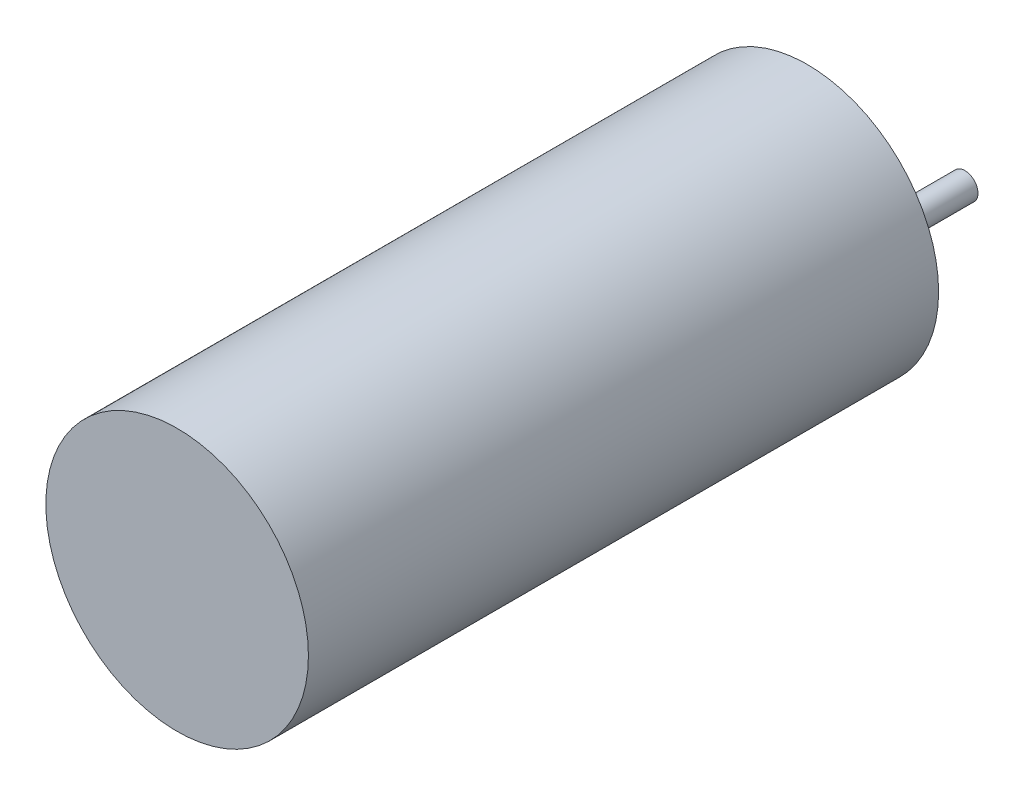
ISO-10303-21;
HEADER;
FILE_DESCRIPTION(('STEP AP214'),'2;1');
FILE_NAME('part.step','',(''),(''),'','','');
FILE_SCHEMA(('AUTOMOTIVE_DESIGN { 1 0 10303 214 1 1 1 1 }'));
ENDSEC;
DATA;
#1=APPLICATION_CONTEXT('core data for automotive mechanical design processes');
#2=APPLICATION_PROTOCOL_DEFINITION('international standard','automotive_design',2000,#1);
#3=PRODUCT_CONTEXT('',#1,'mechanical');
#4=PRODUCT('Part','Part','',(#3));
#5=PRODUCT_RELATED_PRODUCT_CATEGORY('part','',(#4));
#6=PRODUCT_DEFINITION_FORMATION('','',#4);
#7=PRODUCT_DEFINITION_CONTEXT('part definition',#1,'design');
#8=PRODUCT_DEFINITION('design','',#6,#7);
#9=PRODUCT_DEFINITION_SHAPE('','',#8);
#10=(LENGTH_UNIT() NAMED_UNIT(*) SI_UNIT(.MILLI.,.METRE.));
#11=(NAMED_UNIT(*) PLANE_ANGLE_UNIT() SI_UNIT($,.RADIAN.));
#12=(NAMED_UNIT(*) SI_UNIT($,.STERADIAN.) SOLID_ANGLE_UNIT());
#13=UNCERTAINTY_MEASURE_WITH_UNIT(LENGTH_MEASURE(1.E-05),#10,'distance_accuracy_value','');
#14=(GEOMETRIC_REPRESENTATION_CONTEXT(3) GLOBAL_UNCERTAINTY_ASSIGNED_CONTEXT((#13)) GLOBAL_UNIT_ASSIGNED_CONTEXT((#10,
#11,#12)) REPRESENTATION_CONTEXT('',''));
#15=CARTESIAN_POINT('',(0.,0.,0.));
#16=DIRECTION('',(0.,0.,1.));
#17=DIRECTION('',(1.,0.,0.));
#18=AXIS2_PLACEMENT_3D('',#15,#16,#17);
#19=CARTESIAN_POINT('',(0.,0.,12.));
#20=DIRECTION('',(0.,0.,-1.));
#21=DIRECTION('',(-1.,0.,0.));
#22=AXIS2_PLACEMENT_3D('',#19,#20,#21);
#23=CYLINDRICAL_SURFACE('',#22,2.5);
#24=CARTESIAN_POINT('',(0.,0.,12.));
#25=DIRECTION('',(0.,0.,1.));
#26=DIRECTION('',(1.,0.,0.));
#27=AXIS2_PLACEMENT_3D('',#24,#25,#26);
#28=CIRCLE('',#27,2.5);
#29=CARTESIAN_POINT('',(2.5,0.,12.));
#30=VERTEX_POINT('',#29);
#31=EDGE_CURVE('E58',#30,#30,#28,.T.);
#32=ORIENTED_EDGE('',*,*,#31,.F.);
#33=EDGE_LOOP('',(#32));
#34=FACE_BOUND('',#33,.T.);
#35=CARTESIAN_POINT('',(0.,0.,0.));
#36=DIRECTION('',(0.,0.,1.));
#37=DIRECTION('',(1.,0.,0.));
#38=AXIS2_PLACEMENT_3D('',#35,#36,#37);
#39=CIRCLE('',#38,2.5);
#40=CARTESIAN_POINT('',(2.5,0.,0.));
#41=VERTEX_POINT('',#40);
#42=EDGE_CURVE('E55',#41,#41,#39,.T.);
#43=ORIENTED_EDGE('',*,*,#42,.T.);
#44=EDGE_LOOP('',(#43));
#45=FACE_BOUND('',#44,.T.);
#46=ADVANCED_FACE('F35',(#34,#45),#23,.T.);
#47=CARTESIAN_POINT('',(0.,0.,12.));
#48=DIRECTION('',(0.,0.,1.));
#49=DIRECTION('',(1.,0.,0.));
#50=AXIS2_PLACEMENT_3D('',#47,#48,#49);
#51=PLANE('',#50);
#52=ORIENTED_EDGE('',*,*,#31,.T.);
#53=EDGE_LOOP('',(#52));
#54=FACE_BOUND('',#53,.T.);
#55=ADVANCED_FACE('F71',(#54),#51,.T.);
#56=CARTESIAN_POINT('',(0.,0.,0.));
#57=DIRECTION('',(0.,0.,1.));
#58=DIRECTION('',(1.,0.,0.));
#59=AXIS2_PLACEMENT_3D('',#56,#57,#58);
#60=PLANE('',#59);
#61=CARTESIAN_POINT('',(-1.,0.,0.));
#62=DIRECTION('',(0.,0.,1.));
#63=DIRECTION('',(1.,0.,0.));
#64=AXIS2_PLACEMENT_3D('',#61,#62,#63);
#65=CIRCLE('',#64,0.25);
#66=CARTESIAN_POINT('',(-0.75,0.,0.));
#67=VERTEX_POINT('',#66);
#68=EDGE_CURVE('E11',#67,#67,#65,.F.);
#69=ORIENTED_EDGE('',*,*,#68,.F.);
#70=EDGE_LOOP('',(#69));
#71=FACE_BOUND('',#70,.T.);
#72=CARTESIAN_POINT('',(1.,0.,0.));
#73=DIRECTION('',(0.,0.,1.));
#74=DIRECTION('',(1.,0.,0.));
#75=AXIS2_PLACEMENT_3D('',#72,#73,#74);
#76=CIRCLE('',#75,0.25);
#77=CARTESIAN_POINT('',(1.25,0.,0.));
#78=VERTEX_POINT('',#77);
#79=EDGE_CURVE('E42',#78,#78,#76,.F.);
#80=ORIENTED_EDGE('',*,*,#79,.F.);
#81=EDGE_LOOP('',(#80));
#82=FACE_BOUND('',#81,.T.);
#83=ORIENTED_EDGE('',*,*,#42,.F.);
#84=EDGE_LOOP('',(#83));
#85=FACE_BOUND('',#84,.T.);
#86=ADVANCED_FACE('F67',(#71,#82,#85),#60,.F.);
#87=CARTESIAN_POINT('',(1.,0.,-2.));
#88=DIRECTION('',(0.,0.,-1.));
#89=DIRECTION('',(-1.,0.,0.));
#90=AXIS2_PLACEMENT_3D('',#87,#88,#89);
#91=PLANE('',#90);
#92=CARTESIAN_POINT('',(1.,0.,-2.));
#93=DIRECTION('',(0.,0.,-1.));
#94=DIRECTION('',(-1.,0.,0.));
#95=AXIS2_PLACEMENT_3D('',#92,#93,#94);
#96=CIRCLE('',#95,0.25);
#97=CARTESIAN_POINT('',(0.75,0.,-2.));
#98=VERTEX_POINT('',#97);
#99=EDGE_CURVE('E47',#98,#98,#96,.T.);
#100=ORIENTED_EDGE('',*,*,#99,.T.);
#101=EDGE_LOOP('',(#100));
#102=FACE_BOUND('',#101,.T.);
#103=ADVANCED_FACE('F70',(#102),#91,.T.);
#104=CARTESIAN_POINT('',(1.,0.,-2.));
#105=DIRECTION('',(0.,0.,1.));
#106=DIRECTION('',(1.,0.,0.));
#107=AXIS2_PLACEMENT_3D('',#104,#105,#106);
#108=CYLINDRICAL_SURFACE('',#107,0.25);
#109=ORIENTED_EDGE('',*,*,#79,.T.);
#110=EDGE_LOOP('',(#109));
#111=FACE_BOUND('',#110,.T.);
#112=ORIENTED_EDGE('',*,*,#99,.F.);
#113=EDGE_LOOP('',(#112));
#114=FACE_BOUND('',#113,.T.);
#115=ADVANCED_FACE('F65',(#111,#114),#108,.T.);
#116=CARTESIAN_POINT('',(-1.,0.,-2.));
#117=DIRECTION('',(0.,0.,-1.));
#118=DIRECTION('',(1.,0.,0.));
#119=AXIS2_PLACEMENT_3D('',#116,#117,#118);
#120=PLANE('',#119);
#121=CARTESIAN_POINT('',(-1.,0.,-2.));
#122=DIRECTION('',(0.,0.,1.));
#123=DIRECTION('',(1.,0.,0.));
#124=AXIS2_PLACEMENT_3D('',#121,#122,#123);
#125=CIRCLE('',#124,0.25);
#126=CARTESIAN_POINT('',(-0.75,0.,-2.));
#127=VERTEX_POINT('',#126);
#128=EDGE_CURVE('E51',#127,#127,#125,.F.);
#129=ORIENTED_EDGE('',*,*,#128,.T.);
#130=EDGE_LOOP('',(#129));
#131=FACE_BOUND('',#130,.T.);
#132=ADVANCED_FACE('F91',(#131),#120,.T.);
#133=CARTESIAN_POINT('',(-1.,0.,-2.));
#134=DIRECTION('',(0.,0.,1.));
#135=DIRECTION('',(1.,0.,0.));
#136=AXIS2_PLACEMENT_3D('',#133,#134,#135);
#137=CYLINDRICAL_SURFACE('',#136,0.25);
#138=ORIENTED_EDGE('',*,*,#68,.T.);
#139=EDGE_LOOP('',(#138));
#140=FACE_BOUND('',#139,.T.);
#141=ORIENTED_EDGE('',*,*,#128,.F.);
#142=EDGE_LOOP('',(#141));
#143=FACE_BOUND('',#142,.T.);
#144=ADVANCED_FACE('F52',(#140,#143),#137,.T.);
#145=CLOSED_SHELL('',(#46,#55,#86,#103,#115,#132,#144));
#146=MANIFOLD_SOLID_BREP('B2',#145);
#147=ADVANCED_BREP_SHAPE_REPRESENTATION('',(#18,#146),#14);
#148=SHAPE_DEFINITION_REPRESENTATION(#9,#147);
ENDSEC;
END-ISO-10303-21;
